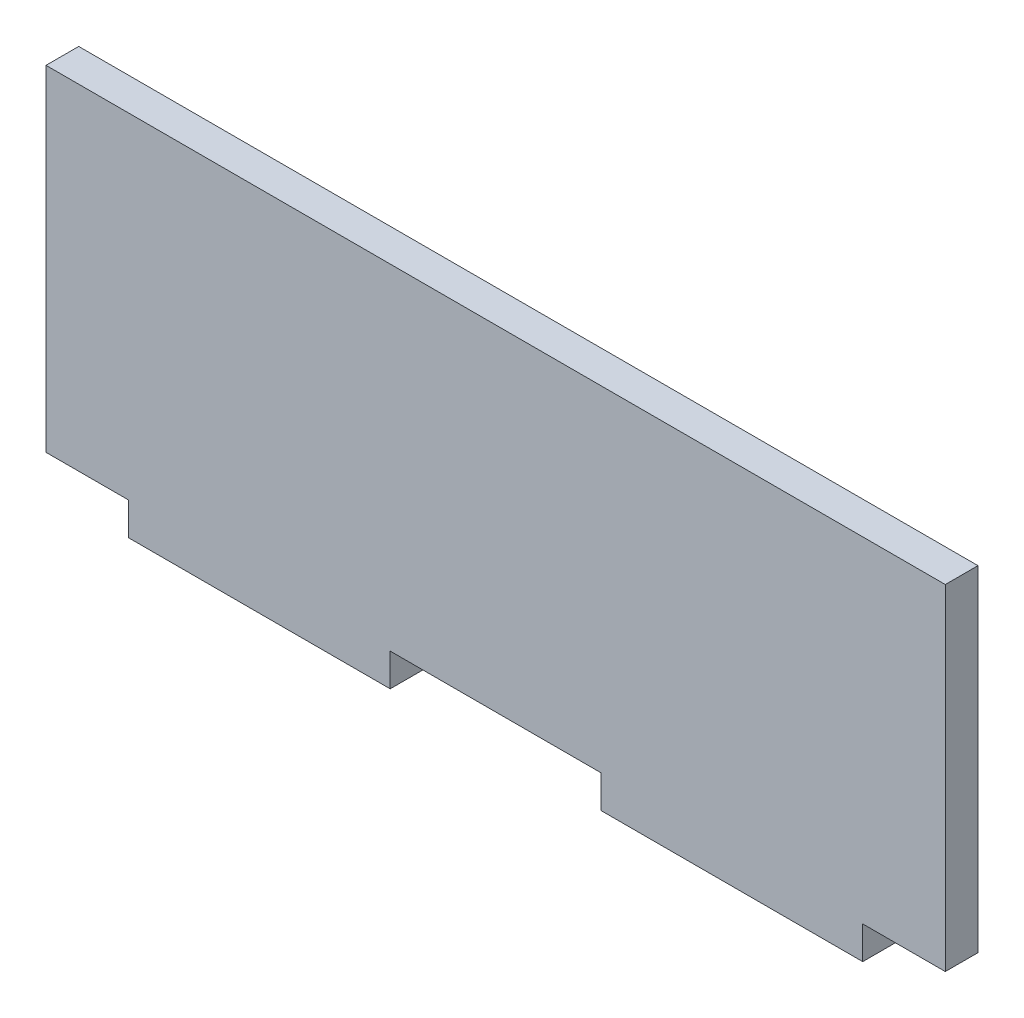
ISO-10303-21;
HEADER;
FILE_DESCRIPTION(('STEP AP214'),'2;1');
FILE_NAME('part.step','',(''),(''),'','','');
FILE_SCHEMA(('AUTOMOTIVE_DESIGN { 1 0 10303 214 1 1 1 1 }'));
ENDSEC;
DATA;
#1=APPLICATION_CONTEXT('core data for automotive mechanical design processes');
#2=APPLICATION_PROTOCOL_DEFINITION('international standard','automotive_design',2000,#1);
#3=PRODUCT_CONTEXT('',#1,'mechanical');
#4=PRODUCT('Part','Part','',(#3));
#5=PRODUCT_RELATED_PRODUCT_CATEGORY('part','',(#4));
#6=PRODUCT_DEFINITION_FORMATION('','',#4);
#7=PRODUCT_DEFINITION_CONTEXT('part definition',#1,'design');
#8=PRODUCT_DEFINITION('design','',#6,#7);
#9=PRODUCT_DEFINITION_SHAPE('','',#8);
#10=(LENGTH_UNIT() NAMED_UNIT(*) SI_UNIT(.MILLI.,.METRE.));
#11=(NAMED_UNIT(*) PLANE_ANGLE_UNIT() SI_UNIT($,.RADIAN.));
#12=(NAMED_UNIT(*) SI_UNIT($,.STERADIAN.) SOLID_ANGLE_UNIT());
#13=UNCERTAINTY_MEASURE_WITH_UNIT(LENGTH_MEASURE(1.E-05),#10,'distance_accuracy_value','');
#14=(GEOMETRIC_REPRESENTATION_CONTEXT(3) GLOBAL_UNCERTAINTY_ASSIGNED_CONTEXT((#13)) GLOBAL_UNIT_ASSIGNED_CONTEXT((#10,
#11,#12)) REPRESENTATION_CONTEXT('',''));
#15=CARTESIAN_POINT('',(0.,0.,0.));
#16=DIRECTION('',(0.,0.,1.));
#17=DIRECTION('',(1.,0.,0.));
#18=AXIS2_PLACEMENT_3D('',#15,#16,#17);
#19=CARTESIAN_POINT('',(0.,-10.25,2.));
#20=DIRECTION('',(0.,1.,0.));
#21=DIRECTION('',(0.,0.,1.));
#22=AXIS2_PLACEMENT_3D('',#19,#20,#21);
#23=PLANE('',#22);
#24=DIRECTION('',(1.,0.,0.));
#25=VECTOR('',#24,1.);
#26=CARTESIAN_POINT('',(0.,-10.25,0.));
#27=LINE('',#26,#25);
#28=CARTESIAN_POINT('',(-27.5,-10.25,0.));
#29=VERTEX_POINT('',#28);
#30=CARTESIAN_POINT('',(-22.45,-10.25,0.));
#31=VERTEX_POINT('',#30);
#32=EDGE_CURVE('E160',#29,#31,#27,.T.);
#33=ORIENTED_EDGE('',*,*,#32,.T.);
#34=DIRECTION('',(0.,0.,-1.));
#35=VECTOR('',#34,1.);
#36=CARTESIAN_POINT('',(-22.45,-10.25,2.));
#37=LINE('',#36,#35);
#38=CARTESIAN_POINT('',(-22.45,-10.25,2.));
#39=VERTEX_POINT('',#38);
#40=EDGE_CURVE('E11',#39,#31,#37,.T.);
#41=ORIENTED_EDGE('',*,*,#40,.F.);
#42=DIRECTION('',(1.,0.,0.));
#43=VECTOR('',#42,1.);
#44=CARTESIAN_POINT('',(0.,-10.25,2.));
#45=LINE('',#44,#43);
#46=CARTESIAN_POINT('',(-27.5,-10.25,2.));
#47=VERTEX_POINT('',#46);
#48=EDGE_CURVE('E187',#47,#39,#45,.T.);
#49=ORIENTED_EDGE('',*,*,#48,.F.);
#50=DIRECTION('',(0.,0.,-1.));
#51=VECTOR('',#50,1.);
#52=CARTESIAN_POINT('',(-27.5,-10.25,2.));
#53=LINE('',#52,#51);
#54=EDGE_CURVE('E54',#47,#29,#53,.T.);
#55=ORIENTED_EDGE('',*,*,#54,.T.);
#56=EDGE_LOOP('',(#33,#41,#49,#55));
#57=FACE_BOUND('',#56,.T.);
#58=ADVANCED_FACE('F37',(#57),#23,.F.);
#59=CARTESIAN_POINT('',(-22.45,0.,2.));
#60=DIRECTION('',(1.,0.,0.));
#61=DIRECTION('',(0.,0.,-1.));
#62=AXIS2_PLACEMENT_3D('',#59,#60,#61);
#63=PLANE('',#62);
#64=DIRECTION('',(0.,-1.,0.));
#65=VECTOR('',#64,1.);
#66=CARTESIAN_POINT('',(-22.45,0.,0.));
#67=LINE('',#66,#65);
#68=CARTESIAN_POINT('',(-22.45,-12.25,0.));
#69=VERTEX_POINT('',#68);
#70=EDGE_CURVE('E162',#31,#69,#67,.T.);
#71=ORIENTED_EDGE('',*,*,#70,.T.);
#72=DIRECTION('',(0.,0.,-1.));
#73=VECTOR('',#72,1.);
#74=CARTESIAN_POINT('',(-22.45,-12.25,2.));
#75=LINE('',#74,#73);
#76=CARTESIAN_POINT('',(-22.45,-12.25,2.));
#77=VERTEX_POINT('',#76);
#78=EDGE_CURVE('E46',#77,#69,#75,.T.);
#79=ORIENTED_EDGE('',*,*,#78,.F.);
#80=DIRECTION('',(0.,-1.,0.));
#81=VECTOR('',#80,1.);
#82=CARTESIAN_POINT('',(-22.45,0.,2.));
#83=LINE('',#82,#81);
#84=EDGE_CURVE('E104',#39,#77,#83,.T.);
#85=ORIENTED_EDGE('',*,*,#84,.F.);
#86=ORIENTED_EDGE('',*,*,#40,.T.);
#87=EDGE_LOOP('',(#71,#79,#85,#86));
#88=FACE_BOUND('',#87,.T.);
#89=ADVANCED_FACE('F39',(#88),#63,.F.);
#90=CARTESIAN_POINT('',(0.,-12.25,2.));
#91=DIRECTION('',(0.,1.,0.));
#92=DIRECTION('',(0.,0.,1.));
#93=AXIS2_PLACEMENT_3D('',#90,#91,#92);
#94=PLANE('',#93);
#95=DIRECTION('',(1.,0.,0.));
#96=VECTOR('',#95,1.);
#97=CARTESIAN_POINT('',(0.,-12.25,0.));
#98=LINE('',#97,#96);
#99=CARTESIAN_POINT('',(-6.45,-12.25,0.));
#100=VERTEX_POINT('',#99);
#101=EDGE_CURVE('E166',#69,#100,#98,.T.);
#102=ORIENTED_EDGE('',*,*,#101,.T.);
#103=DIRECTION('',(0.,0.,-1.));
#104=VECTOR('',#103,1.);
#105=CARTESIAN_POINT('',(-6.45,-12.25,2.));
#106=LINE('',#105,#104);
#107=CARTESIAN_POINT('',(-6.45,-12.25,2.));
#108=VERTEX_POINT('',#107);
#109=EDGE_CURVE('E202',#108,#100,#106,.T.);
#110=ORIENTED_EDGE('',*,*,#109,.F.);
#111=DIRECTION('',(1.,0.,0.));
#112=VECTOR('',#111,1.);
#113=CARTESIAN_POINT('',(0.,-12.25,2.));
#114=LINE('',#113,#112);
#115=EDGE_CURVE('E209',#77,#108,#114,.T.);
#116=ORIENTED_EDGE('',*,*,#115,.F.);
#117=ORIENTED_EDGE('',*,*,#78,.T.);
#118=EDGE_LOOP('',(#102,#110,#116,#117));
#119=FACE_BOUND('',#118,.T.);
#120=ADVANCED_FACE('F207',(#119),#94,.F.);
#121=CARTESIAN_POINT('',(-6.45,0.,2.));
#122=DIRECTION('',(1.,0.,0.));
#123=DIRECTION('',(0.,0.,-1.));
#124=AXIS2_PLACEMENT_3D('',#121,#122,#123);
#125=PLANE('',#124);
#126=DIRECTION('',(0.,-1.,0.));
#127=VECTOR('',#126,1.);
#128=CARTESIAN_POINT('',(-6.45,0.,0.));
#129=LINE('',#128,#127);
#130=CARTESIAN_POINT('',(-6.45,-10.25,0.));
#131=VERTEX_POINT('',#130);
#132=EDGE_CURVE('E169',#131,#100,#129,.T.);
#133=ORIENTED_EDGE('',*,*,#132,.F.);
#134=DIRECTION('',(0.,0.,-1.));
#135=VECTOR('',#134,1.);
#136=CARTESIAN_POINT('',(-6.45,-10.25,2.));
#137=LINE('',#136,#135);
#138=CARTESIAN_POINT('',(-6.45,-10.25,2.));
#139=VERTEX_POINT('',#138);
#140=EDGE_CURVE('E200',#139,#131,#137,.T.);
#141=ORIENTED_EDGE('',*,*,#140,.F.);
#142=DIRECTION('',(0.,-1.,0.));
#143=VECTOR('',#142,1.);
#144=CARTESIAN_POINT('',(-6.45,0.,2.));
#145=LINE('',#144,#143);
#146=EDGE_CURVE('E220',#139,#108,#145,.T.);
#147=ORIENTED_EDGE('',*,*,#146,.T.);
#148=ORIENTED_EDGE('',*,*,#109,.T.);
#149=EDGE_LOOP('',(#133,#141,#147,#148));
#150=FACE_BOUND('',#149,.T.);
#151=ADVANCED_FACE('F216',(#150),#125,.T.);
#152=CARTESIAN_POINT('',(6.45000000000001,-10.25,0.));
#153=VERTEX_POINT('',#152);
#154=EDGE_CURVE('E164',#131,#153,#27,.T.);
#155=ORIENTED_EDGE('',*,*,#154,.T.);
#156=DIRECTION('',(0.,0.,-1.));
#157=VECTOR('',#156,1.);
#158=CARTESIAN_POINT('',(6.45000000000001,-10.25,2.));
#159=LINE('',#158,#157);
#160=CARTESIAN_POINT('',(6.45000000000001,-10.25,2.));
#161=VERTEX_POINT('',#160);
#162=EDGE_CURVE('E197',#161,#153,#159,.T.);
#163=ORIENTED_EDGE('',*,*,#162,.F.);
#164=EDGE_CURVE('E221',#139,#161,#45,.T.);
#165=ORIENTED_EDGE('',*,*,#164,.F.);
#166=ORIENTED_EDGE('',*,*,#140,.T.);
#167=EDGE_LOOP('',(#155,#163,#165,#166));
#168=FACE_BOUND('',#167,.T.);
#169=ADVANCED_FACE('F241',(#168),#23,.F.);
#170=CARTESIAN_POINT('',(6.45000000000001,0.,2.));
#171=DIRECTION('',(1.,0.,0.));
#172=DIRECTION('',(0.,0.,-1.));
#173=AXIS2_PLACEMENT_3D('',#170,#171,#172);
#174=PLANE('',#173);
#175=DIRECTION('',(0.,-1.,0.));
#176=VECTOR('',#175,1.);
#177=CARTESIAN_POINT('',(6.45000000000001,0.,0.));
#178=LINE('',#177,#176);
#179=CARTESIAN_POINT('',(6.45000000000001,-12.25,0.));
#180=VERTEX_POINT('',#179);
#181=EDGE_CURVE('E172',#153,#180,#178,.T.);
#182=ORIENTED_EDGE('',*,*,#181,.T.);
#183=DIRECTION('',(0.,0.,-1.));
#184=VECTOR('',#183,1.);
#185=CARTESIAN_POINT('',(6.45000000000001,-12.25,2.));
#186=LINE('',#185,#184);
#187=CARTESIAN_POINT('',(6.45000000000001,-12.25,2.));
#188=VERTEX_POINT('',#187);
#189=EDGE_CURVE('E195',#188,#180,#186,.T.);
#190=ORIENTED_EDGE('',*,*,#189,.F.);
#191=DIRECTION('',(0.,-1.,0.));
#192=VECTOR('',#191,1.);
#193=CARTESIAN_POINT('',(6.45000000000001,0.,2.));
#194=LINE('',#193,#192);
#195=EDGE_CURVE('E223',#161,#188,#194,.T.);
#196=ORIENTED_EDGE('',*,*,#195,.F.);
#197=ORIENTED_EDGE('',*,*,#162,.T.);
#198=EDGE_LOOP('',(#182,#190,#196,#197));
#199=FACE_BOUND('',#198,.T.);
#200=ADVANCED_FACE('F248',(#199),#174,.F.);
#201=CARTESIAN_POINT('',(0.,-12.25,2.));
#202=DIRECTION('',(0.,-1.,0.));
#203=DIRECTION('',(1.,0.,0.));
#204=AXIS2_PLACEMENT_3D('',#201,#202,#203);
#205=PLANE('',#204);
#206=DIRECTION('',(-1.,0.,0.));
#207=VECTOR('',#206,1.);
#208=CARTESIAN_POINT('',(0.,-12.25,0.));
#209=LINE('',#208,#207);
#210=CARTESIAN_POINT('',(22.45,-12.25,0.));
#211=VERTEX_POINT('',#210);
#212=EDGE_CURVE('E175',#211,#180,#209,.T.);
#213=ORIENTED_EDGE('',*,*,#212,.F.);
#214=DIRECTION('',(0.,0.,-1.));
#215=VECTOR('',#214,1.);
#216=CARTESIAN_POINT('',(22.45,-12.25,2.));
#217=LINE('',#216,#215);
#218=CARTESIAN_POINT('',(22.45,-12.25,2.));
#219=VERTEX_POINT('',#218);
#220=EDGE_CURVE('E193',#219,#211,#217,.T.);
#221=ORIENTED_EDGE('',*,*,#220,.F.);
#222=DIRECTION('',(-1.,0.,0.));
#223=VECTOR('',#222,1.);
#224=CARTESIAN_POINT('',(0.,-12.25,2.));
#225=LINE('',#224,#223);
#226=EDGE_CURVE('E229',#219,#188,#225,.T.);
#227=ORIENTED_EDGE('',*,*,#226,.T.);
#228=ORIENTED_EDGE('',*,*,#189,.T.);
#229=EDGE_LOOP('',(#213,#221,#227,#228));
#230=FACE_BOUND('',#229,.T.);
#231=ADVANCED_FACE('F257',(#230),#205,.T.);
#232=CARTESIAN_POINT('',(22.45,0.,2.));
#233=DIRECTION('',(1.,0.,0.));
#234=DIRECTION('',(0.,0.,-1.));
#235=AXIS2_PLACEMENT_3D('',#232,#233,#234);
#236=PLANE('',#235);
#237=DIRECTION('',(0.,-1.,0.));
#238=VECTOR('',#237,1.);
#239=CARTESIAN_POINT('',(22.45,0.,0.));
#240=LINE('',#239,#238);
#241=CARTESIAN_POINT('',(22.45,-10.25,0.));
#242=VERTEX_POINT('',#241);
#243=EDGE_CURVE('E178',#242,#211,#240,.T.);
#244=ORIENTED_EDGE('',*,*,#243,.F.);
#245=DIRECTION('',(0.,0.,-1.));
#246=VECTOR('',#245,1.);
#247=CARTESIAN_POINT('',(22.45,-10.25,2.));
#248=LINE('',#247,#246);
#249=CARTESIAN_POINT('',(22.45,-10.25,2.));
#250=VERTEX_POINT('',#249);
#251=EDGE_CURVE('E191',#250,#242,#248,.T.);
#252=ORIENTED_EDGE('',*,*,#251,.F.);
#253=DIRECTION('',(0.,-1.,0.));
#254=VECTOR('',#253,1.);
#255=CARTESIAN_POINT('',(22.45,0.,2.));
#256=LINE('',#255,#254);
#257=EDGE_CURVE('E231',#250,#219,#256,.T.);
#258=ORIENTED_EDGE('',*,*,#257,.T.);
#259=ORIENTED_EDGE('',*,*,#220,.T.);
#260=EDGE_LOOP('',(#244,#252,#258,#259));
#261=FACE_BOUND('',#260,.T.);
#262=ADVANCED_FACE('F251',(#261),#236,.T.);
#263=CARTESIAN_POINT('',(27.5,-10.25,0.));
#264=VERTEX_POINT('',#263);
#265=EDGE_CURVE('E163',#242,#264,#27,.T.);
#266=ORIENTED_EDGE('',*,*,#265,.T.);
#267=DIRECTION('',(0.,0.,-1.));
#268=VECTOR('',#267,1.);
#269=CARTESIAN_POINT('',(27.5,-10.25,2.));
#270=LINE('',#269,#268);
#271=CARTESIAN_POINT('',(27.5,-10.25,2.));
#272=VERTEX_POINT('',#271);
#273=EDGE_CURVE('E152',#272,#264,#270,.T.);
#274=ORIENTED_EDGE('',*,*,#273,.F.);
#275=EDGE_CURVE('E140',#250,#272,#45,.T.);
#276=ORIENTED_EDGE('',*,*,#275,.F.);
#277=ORIENTED_EDGE('',*,*,#251,.T.);
#278=EDGE_LOOP('',(#266,#274,#276,#277));
#279=FACE_BOUND('',#278,.T.);
#280=ADVANCED_FACE('F242',(#279),#23,.F.);
#281=CARTESIAN_POINT('',(27.5,0.,2.));
#282=DIRECTION('',(-1.,0.,0.));
#283=DIRECTION('',(0.,0.,1.));
#284=AXIS2_PLACEMENT_3D('',#281,#282,#283);
#285=PLANE('',#284);
#286=DIRECTION('',(0.,1.,0.));
#287=VECTOR('',#286,1.);
#288=CARTESIAN_POINT('',(27.5,0.,0.));
#289=LINE('',#288,#287);
#290=CARTESIAN_POINT('',(27.5,10.25,0.));
#291=VERTEX_POINT('',#290);
#292=EDGE_CURVE('E149',#264,#291,#289,.T.);
#293=ORIENTED_EDGE('',*,*,#292,.T.);
#294=DIRECTION('',(0.,0.,-1.));
#295=VECTOR('',#294,1.);
#296=CARTESIAN_POINT('',(27.5,10.25,2.));
#297=LINE('',#296,#295);
#298=CARTESIAN_POINT('',(27.5,10.25,2.));
#299=VERTEX_POINT('',#298);
#300=EDGE_CURVE('E146',#299,#291,#297,.T.);
#301=ORIENTED_EDGE('',*,*,#300,.F.);
#302=DIRECTION('',(0.,1.,0.));
#303=VECTOR('',#302,1.);
#304=CARTESIAN_POINT('',(27.5,0.,2.));
#305=LINE('',#304,#303);
#306=EDGE_CURVE('E132',#272,#299,#305,.T.);
#307=ORIENTED_EDGE('',*,*,#306,.F.);
#308=ORIENTED_EDGE('',*,*,#273,.T.);
#309=EDGE_LOOP('',(#293,#301,#307,#308));
#310=FACE_BOUND('',#309,.T.);
#311=ADVANCED_FACE('F147',(#310),#285,.F.);
#312=CARTESIAN_POINT('',(0.,10.25,2.));
#313=DIRECTION('',(0.,1.,0.));
#314=DIRECTION('',(0.,0.,1.));
#315=AXIS2_PLACEMENT_3D('',#312,#313,#314);
#316=PLANE('',#315);
#317=DIRECTION('',(1.,0.,0.));
#318=VECTOR('',#317,1.);
#319=CARTESIAN_POINT('',(0.,10.25,0.));
#320=LINE('',#319,#318);
#321=CARTESIAN_POINT('',(-27.5,10.25,0.));
#322=VERTEX_POINT('',#321);
#323=EDGE_CURVE('E182',#322,#291,#320,.T.);
#324=ORIENTED_EDGE('',*,*,#323,.F.);
#325=DIRECTION('',(0.,0.,-1.));
#326=VECTOR('',#325,1.);
#327=CARTESIAN_POINT('',(-27.5,10.25,2.));
#328=LINE('',#327,#326);
#329=CARTESIAN_POINT('',(-27.5,10.25,2.));
#330=VERTEX_POINT('',#329);
#331=EDGE_CURVE('E92',#330,#322,#328,.T.);
#332=ORIENTED_EDGE('',*,*,#331,.F.);
#333=DIRECTION('',(1.,0.,0.));
#334=VECTOR('',#333,1.);
#335=CARTESIAN_POINT('',(0.,10.25,2.));
#336=LINE('',#335,#334);
#337=EDGE_CURVE('E137',#330,#299,#336,.T.);
#338=ORIENTED_EDGE('',*,*,#337,.T.);
#339=ORIENTED_EDGE('',*,*,#300,.T.);
#340=EDGE_LOOP('',(#324,#332,#338,#339));
#341=FACE_BOUND('',#340,.T.);
#342=ADVANCED_FACE('F154',(#341),#316,.T.);
#343=CARTESIAN_POINT('',(-27.5,0.,2.));
#344=DIRECTION('',(-1.,0.,0.));
#345=DIRECTION('',(0.,0.,1.));
#346=AXIS2_PLACEMENT_3D('',#343,#344,#345);
#347=PLANE('',#346);
#348=DIRECTION('',(0.,1.,0.));
#349=VECTOR('',#348,1.);
#350=CARTESIAN_POINT('',(-27.5,0.,0.));
#351=LINE('',#350,#349);
#352=EDGE_CURVE('E184',#29,#322,#351,.T.);
#353=ORIENTED_EDGE('',*,*,#352,.F.);
#354=ORIENTED_EDGE('',*,*,#54,.F.);
#355=DIRECTION('',(0.,1.,0.));
#356=VECTOR('',#355,1.);
#357=CARTESIAN_POINT('',(-27.5,0.,2.));
#358=LINE('',#357,#356);
#359=EDGE_CURVE('E155',#47,#330,#358,.T.);
#360=ORIENTED_EDGE('',*,*,#359,.T.);
#361=ORIENTED_EDGE('',*,*,#331,.T.);
#362=EDGE_LOOP('',(#353,#354,#360,#361));
#363=FACE_BOUND('',#362,.T.);
#364=ADVANCED_FACE('F260',(#363),#347,.T.);
#365=CARTESIAN_POINT('',(0.,0.,2.));
#366=DIRECTION('',(0.,0.,1.));
#367=DIRECTION('',(1.,0.,0.));
#368=AXIS2_PLACEMENT_3D('',#365,#366,#367);
#369=PLANE('',#368);
#370=ORIENTED_EDGE('',*,*,#48,.T.);
#371=ORIENTED_EDGE('',*,*,#84,.T.);
#372=ORIENTED_EDGE('',*,*,#115,.T.);
#373=ORIENTED_EDGE('',*,*,#146,.F.);
#374=ORIENTED_EDGE('',*,*,#164,.T.);
#375=ORIENTED_EDGE('',*,*,#195,.T.);
#376=ORIENTED_EDGE('',*,*,#226,.F.);
#377=ORIENTED_EDGE('',*,*,#257,.F.);
#378=ORIENTED_EDGE('',*,*,#275,.T.);
#379=ORIENTED_EDGE('',*,*,#306,.T.);
#380=ORIENTED_EDGE('',*,*,#337,.F.);
#381=ORIENTED_EDGE('',*,*,#359,.F.);
#382=EDGE_LOOP('',(#370,#371,#372,#373,#374,#375,#376,#377,#378,#379,#380,#381));
#383=FACE_BOUND('',#382,.T.);
#384=ADVANCED_FACE('F134',(#383),#369,.T.);
#385=CARTESIAN_POINT('',(0.,0.,0.));
#386=DIRECTION('',(0.,0.,1.));
#387=DIRECTION('',(1.,0.,0.));
#388=AXIS2_PLACEMENT_3D('',#385,#386,#387);
#389=PLANE('',#388);
#390=ORIENTED_EDGE('',*,*,#32,.F.);
#391=ORIENTED_EDGE('',*,*,#352,.T.);
#392=ORIENTED_EDGE('',*,*,#323,.T.);
#393=ORIENTED_EDGE('',*,*,#292,.F.);
#394=ORIENTED_EDGE('',*,*,#265,.F.);
#395=ORIENTED_EDGE('',*,*,#243,.T.);
#396=ORIENTED_EDGE('',*,*,#212,.T.);
#397=ORIENTED_EDGE('',*,*,#181,.F.);
#398=ORIENTED_EDGE('',*,*,#154,.F.);
#399=ORIENTED_EDGE('',*,*,#132,.T.);
#400=ORIENTED_EDGE('',*,*,#101,.F.);
#401=ORIENTED_EDGE('',*,*,#70,.F.);
#402=EDGE_LOOP('',(#390,#391,#392,#393,#394,#395,#396,#397,#398,#399,#400,#401));
#403=FACE_BOUND('',#402,.T.);
#404=ADVANCED_FACE('F211',(#403),#389,.F.);
#405=CLOSED_SHELL('',(#58,#89,#120,#151,#169,#200,#231,#262,#280,#311,#342,#364,#384,#404));
#406=MANIFOLD_SOLID_BREP('B2',#405);
#407=ADVANCED_BREP_SHAPE_REPRESENTATION('',(#18,#406),#14);
#408=SHAPE_DEFINITION_REPRESENTATION(#9,#407);
ENDSEC;
END-ISO-10303-21;
